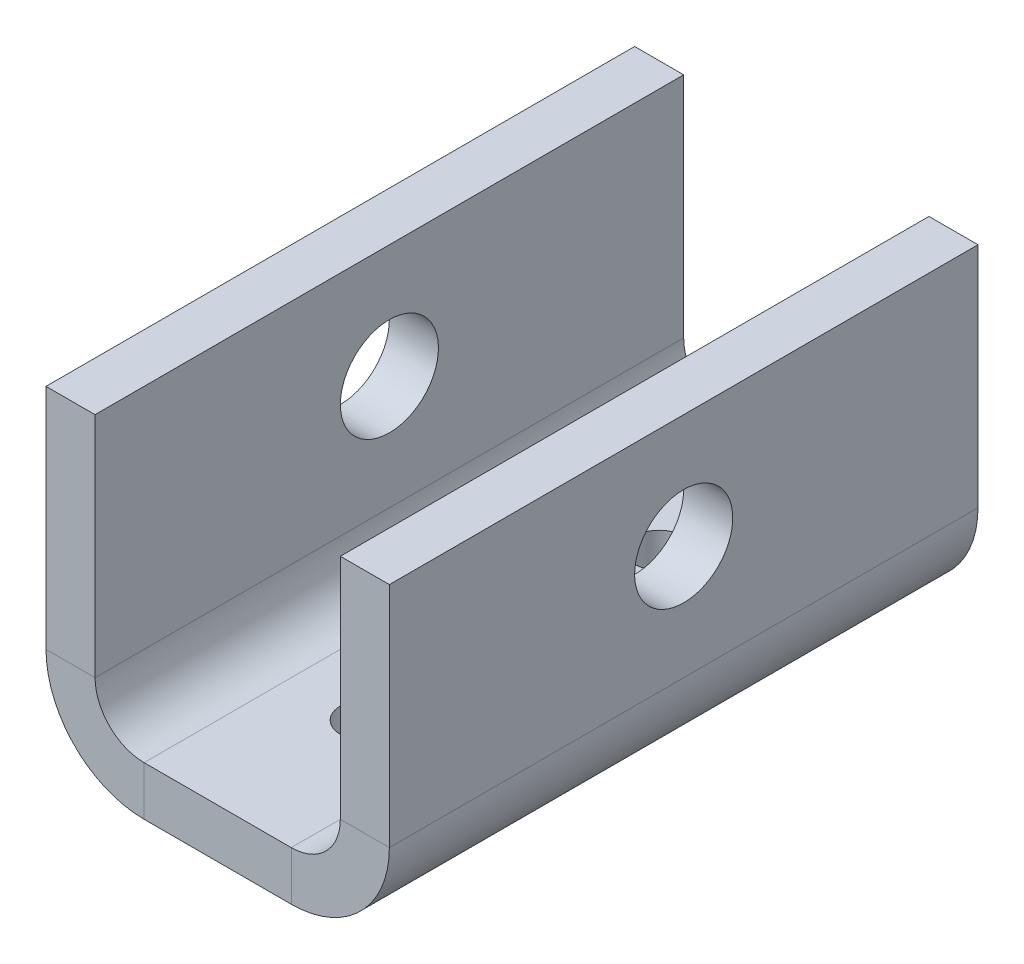
ISO-10303-21;
HEADER;
FILE_DESCRIPTION(('STEP AP214'),'2;1');
FILE_NAME('part.step','',(''),(''),'','','');
FILE_SCHEMA(('AUTOMOTIVE_DESIGN { 1 0 10303 214 1 1 1 1 }'));
ENDSEC;
DATA;
#1=APPLICATION_CONTEXT('core data for automotive mechanical design processes');
#2=APPLICATION_PROTOCOL_DEFINITION('international standard','automotive_design',2000,#1);
#3=PRODUCT_CONTEXT('',#1,'mechanical');
#4=PRODUCT('Part','Part','',(#3));
#5=PRODUCT_RELATED_PRODUCT_CATEGORY('part','',(#4));
#6=PRODUCT_DEFINITION_FORMATION('','',#4);
#7=PRODUCT_DEFINITION_CONTEXT('part definition',#1,'design');
#8=PRODUCT_DEFINITION('design','',#6,#7);
#9=PRODUCT_DEFINITION_SHAPE('','',#8);
#10=(LENGTH_UNIT() NAMED_UNIT(*) SI_UNIT(.MILLI.,.METRE.));
#11=(NAMED_UNIT(*) PLANE_ANGLE_UNIT() SI_UNIT($,.RADIAN.));
#12=(NAMED_UNIT(*) SI_UNIT($,.STERADIAN.) SOLID_ANGLE_UNIT());
#13=UNCERTAINTY_MEASURE_WITH_UNIT(LENGTH_MEASURE(1.E-05),#10,'distance_accuracy_value','');
#14=(GEOMETRIC_REPRESENTATION_CONTEXT(3) GLOBAL_UNCERTAINTY_ASSIGNED_CONTEXT((#13)) GLOBAL_UNIT_ASSIGNED_CONTEXT((#10,
#11,#12)) REPRESENTATION_CONTEXT('',''));
#15=CARTESIAN_POINT('',(0.,0.,0.));
#16=DIRECTION('',(0.,0.,1.));
#17=DIRECTION('',(1.,0.,0.));
#18=AXIS2_PLACEMENT_3D('',#15,#16,#17);
#19=CARTESIAN_POINT('',(0.,-5.,0.));
#20=DIRECTION('',(0.,-1.,0.));
#21=DIRECTION('',(0.,0.,-1.));
#22=AXIS2_PLACEMENT_3D('',#19,#20,#21);
#23=PLANE('',#22);
#24=CARTESIAN_POINT('',(0.,-5.,-15.));
#25=DIRECTION('',(0.,-1.,0.));
#26=DIRECTION('',(0.,0.,-1.));
#27=AXIS2_PLACEMENT_3D('',#24,#25,#26);
#28=CIRCLE('',#27,2.5);
#29=CARTESIAN_POINT('',(0.,-5.,-17.5));
#30=VERTEX_POINT('',#29);
#31=EDGE_CURVE('E266',#30,#30,#28,.T.);
#32=ORIENTED_EDGE('',*,*,#31,.F.);
#33=EDGE_LOOP('',(#32));
#34=FACE_BOUND('',#33,.T.);
#35=CARTESIAN_POINT('',(0.,-5.,15.));
#36=DIRECTION('',(0.,-1.,0.));
#37=DIRECTION('',(0.,0.,-1.));
#38=AXIS2_PLACEMENT_3D('',#35,#36,#37);
#39=CIRCLE('',#38,2.5);
#40=CARTESIAN_POINT('',(0.,-5.,12.5));
#41=VERTEX_POINT('',#40);
#42=EDGE_CURVE('E272',#41,#41,#39,.T.);
#43=ORIENTED_EDGE('',*,*,#42,.F.);
#44=EDGE_LOOP('',(#43));
#45=FACE_BOUND('',#44,.T.);
#46=DIRECTION('',(-1.,0.,0.));
#47=VECTOR('',#46,1.);
#48=CARTESIAN_POINT('',(-42.5,-5.,-30.));
#49=LINE('',#48,#47);
#50=CARTESIAN_POINT('',(7.50000000000001,-5.,-30.));
#51=VERTEX_POINT('',#50);
#52=CARTESIAN_POINT('',(-7.49999999999999,-5.,-30.));
#53=VERTEX_POINT('',#52);
#54=EDGE_CURVE('E254',#51,#53,#49,.T.);
#55=ORIENTED_EDGE('',*,*,#54,.F.);
#56=DIRECTION('',(0.,0.,1.));
#57=VECTOR('',#56,1.);
#58=CARTESIAN_POINT('',(7.50000000000001,-5.,0.));
#59=LINE('',#58,#57);
#60=CARTESIAN_POINT('',(7.5,-5.,30.));
#61=VERTEX_POINT('',#60);
#62=EDGE_CURVE('E245',#51,#61,#59,.T.);
#63=ORIENTED_EDGE('',*,*,#62,.T.);
#64=DIRECTION('',(1.,0.,0.));
#65=VECTOR('',#64,1.);
#66=CARTESIAN_POINT('',(-42.5,-5.,30.));
#67=LINE('',#66,#65);
#68=CARTESIAN_POINT('',(-7.49999999999999,-5.,30.));
#69=VERTEX_POINT('',#68);
#70=EDGE_CURVE('E237',#69,#61,#67,.T.);
#71=ORIENTED_EDGE('',*,*,#70,.F.);
#72=DIRECTION('',(0.,0.,1.));
#73=VECTOR('',#72,1.);
#74=CARTESIAN_POINT('',(-7.49999999999999,-5.,0.));
#75=LINE('',#74,#73);
#76=EDGE_CURVE('E233',#53,#69,#75,.T.);
#77=ORIENTED_EDGE('',*,*,#76,.F.);
#78=EDGE_LOOP('',(#55,#63,#71,#77));
#79=FACE_BOUND('',#78,.T.);
#80=ADVANCED_FACE('F53',(#34,#45,#79),#23,.T.);
#81=CARTESIAN_POINT('',(-42.5,-5.,-30.));
#82=DIRECTION('',(0.,0.,-1.));
#83=DIRECTION('',(-1.,0.,0.));
#84=AXIS2_PLACEMENT_3D('',#81,#82,#83);
#85=PLANE('',#84);
#86=DIRECTION('',(-1.,0.,0.));
#87=VECTOR('',#86,1.);
#88=CARTESIAN_POINT('',(-42.5,0.,-30.));
#89=LINE('',#88,#87);
#90=CARTESIAN_POINT('',(7.50000000000001,0.,-30.));
#91=VERTEX_POINT('',#90);
#92=CARTESIAN_POINT('',(-7.49999999999999,0.,-30.));
#93=VERTEX_POINT('',#92);
#94=EDGE_CURVE('E76',#91,#93,#89,.T.);
#95=ORIENTED_EDGE('',*,*,#94,.F.);
#96=DIRECTION('',(0.,-1.,0.));
#97=VECTOR('',#96,1.);
#98=CARTESIAN_POINT('',(7.50000000000001,-5.,-30.));
#99=LINE('',#98,#97);
#100=EDGE_CURVE('E248',#91,#51,#99,.T.);
#101=ORIENTED_EDGE('',*,*,#100,.T.);
#102=ORIENTED_EDGE('',*,*,#54,.T.);
#103=DIRECTION('',(0.,-1.,0.));
#104=VECTOR('',#103,1.);
#105=CARTESIAN_POINT('',(-7.49999999999999,-5.,-30.));
#106=LINE('',#105,#104);
#107=EDGE_CURVE('E242',#93,#53,#106,.T.);
#108=ORIENTED_EDGE('',*,*,#107,.F.);
#109=EDGE_LOOP('',(#95,#101,#102,#108));
#110=FACE_BOUND('',#109,.T.);
#111=ADVANCED_FACE('F306',(#110),#85,.T.);
#112=CARTESIAN_POINT('',(-42.5,-5.,30.));
#113=DIRECTION('',(0.,0.,1.));
#114=DIRECTION('',(1.,0.,0.));
#115=AXIS2_PLACEMENT_3D('',#112,#113,#114);
#116=PLANE('',#115);
#117=ORIENTED_EDGE('',*,*,#70,.T.);
#118=DIRECTION('',(0.,1.,0.));
#119=VECTOR('',#118,1.);
#120=CARTESIAN_POINT('',(7.50000000000001,-5.,30.));
#121=LINE('',#120,#119);
#122=CARTESIAN_POINT('',(7.50000000000001,0.,30.));
#123=VERTEX_POINT('',#122);
#124=EDGE_CURVE('E12',#61,#123,#121,.T.);
#125=ORIENTED_EDGE('',*,*,#124,.T.);
#126=DIRECTION('',(1.,0.,0.));
#127=VECTOR('',#126,1.);
#128=CARTESIAN_POINT('',(-42.5,0.,30.));
#129=LINE('',#128,#127);
#130=CARTESIAN_POINT('',(-7.49999999999999,0.,30.));
#131=VERTEX_POINT('',#130);
#132=EDGE_CURVE('E255',#131,#123,#129,.T.);
#133=ORIENTED_EDGE('',*,*,#132,.F.);
#134=DIRECTION('',(0.,1.,0.));
#135=VECTOR('',#134,1.);
#136=CARTESIAN_POINT('',(-7.49999999999999,-5.,30.));
#137=LINE('',#136,#135);
#138=EDGE_CURVE('E236',#69,#131,#137,.T.);
#139=ORIENTED_EDGE('',*,*,#138,.F.);
#140=EDGE_LOOP('',(#117,#125,#133,#139));
#141=FACE_BOUND('',#140,.T.);
#142=ADVANCED_FACE('F55',(#141),#116,.T.);
#143=CARTESIAN_POINT('',(0.,0.,0.));
#144=DIRECTION('',(0.,-1.,0.));
#145=DIRECTION('',(0.,0.,-1.));
#146=AXIS2_PLACEMENT_3D('',#143,#144,#145);
#147=PLANE('',#146);
#148=CARTESIAN_POINT('',(0.,0.,-15.));
#149=DIRECTION('',(0.,-1.,0.));
#150=DIRECTION('',(0.,0.,-1.));
#151=AXIS2_PLACEMENT_3D('',#148,#149,#150);
#152=CIRCLE('',#151,2.5);
#153=CARTESIAN_POINT('',(0.,0.,-17.5));
#154=VERTEX_POINT('',#153);
#155=EDGE_CURVE('E57',#154,#154,#152,.T.);
#156=ORIENTED_EDGE('',*,*,#155,.T.);
#157=EDGE_LOOP('',(#156));
#158=FACE_BOUND('',#157,.T.);
#159=CARTESIAN_POINT('',(0.,0.,15.));
#160=DIRECTION('',(0.,-1.,0.));
#161=DIRECTION('',(0.,0.,-1.));
#162=AXIS2_PLACEMENT_3D('',#159,#160,#161);
#163=CIRCLE('',#162,2.5);
#164=CARTESIAN_POINT('',(0.,0.,12.5));
#165=VERTEX_POINT('',#164);
#166=EDGE_CURVE('E264',#165,#165,#163,.T.);
#167=ORIENTED_EDGE('',*,*,#166,.T.);
#168=EDGE_LOOP('',(#167));
#169=FACE_BOUND('',#168,.T.);
#170=DIRECTION('',(0.,0.,1.));
#171=VECTOR('',#170,1.);
#172=CARTESIAN_POINT('',(7.50000000000001,0.,0.));
#173=LINE('',#172,#171);
#174=EDGE_CURVE('E62',#91,#123,#173,.T.);
#175=ORIENTED_EDGE('',*,*,#174,.F.);
#176=ORIENTED_EDGE('',*,*,#94,.T.);
#177=DIRECTION('',(0.,0.,1.));
#178=VECTOR('',#177,1.);
#179=CARTESIAN_POINT('',(-7.49999999999999,0.,0.));
#180=LINE('',#179,#178);
#181=EDGE_CURVE('E240',#93,#131,#180,.T.);
#182=ORIENTED_EDGE('',*,*,#181,.T.);
#183=ORIENTED_EDGE('',*,*,#132,.T.);
#184=EDGE_LOOP('',(#175,#176,#182,#183));
#185=FACE_BOUND('',#184,.T.);
#186=ADVANCED_FACE('F370',(#158,#169,#185),#147,.F.);
#187=CARTESIAN_POINT('',(-7.49999999999999,5.,-30.));
#188=DIRECTION('',(0.,0.,-1.));
#189=DIRECTION('',(-1.,0.,0.));
#190=AXIS2_PLACEMENT_3D('',#187,#188,#189);
#191=PLANE('',#190);
#192=DIRECTION('',(-1.,0.,0.));
#193=VECTOR('',#192,1.);
#194=CARTESIAN_POINT('',(-17.5,5.00000000000003,-30.));
#195=LINE('',#194,#193);
#196=CARTESIAN_POINT('',(-12.5,5.00000000000001,-30.));
#197=VERTEX_POINT('',#196);
#198=CARTESIAN_POINT('',(-17.5,5.00000000000003,-30.));
#199=VERTEX_POINT('',#198);
#200=EDGE_CURVE('E198',#197,#199,#195,.T.);
#201=ORIENTED_EDGE('',*,*,#200,.F.);
#202=CARTESIAN_POINT('',(-7.49999999999999,5.,-29.9999999999999));
#203=DIRECTION('',(0.,0.,-1.));
#204=DIRECTION('',(-1.,0.,0.));
#205=AXIS2_PLACEMENT_3D('',#202,#203,#204);
#206=CIRCLE('',#205,5.);
#207=EDGE_CURVE('E195',#197,#93,#206,.F.);
#208=ORIENTED_EDGE('',*,*,#207,.T.);
#209=ORIENTED_EDGE('',*,*,#107,.T.);
#210=CARTESIAN_POINT('',(-7.49999999999999,5.,-30.));
#211=DIRECTION('',(0.,0.,1.));
#212=DIRECTION('',(-1.,0.,0.));
#213=AXIS2_PLACEMENT_3D('',#210,#211,#212);
#214=CIRCLE('',#213,10.);
#215=EDGE_CURVE('E222',#199,#53,#214,.T.);
#216=ORIENTED_EDGE('',*,*,#215,.F.);
#217=EDGE_LOOP('',(#201,#208,#209,#216));
#218=FACE_BOUND('',#217,.T.);
#219=ADVANCED_FACE('F336',(#218),#191,.T.);
#220=CARTESIAN_POINT('',(-7.49999999999999,5.,30.));
#221=DIRECTION('',(0.,0.,1.));
#222=DIRECTION('',(1.,0.,0.));
#223=AXIS2_PLACEMENT_3D('',#220,#221,#222);
#224=PLANE('',#223);
#225=CARTESIAN_POINT('',(-7.49999999999999,5.,30.));
#226=DIRECTION('',(0.,0.,-1.));
#227=DIRECTION('',(-1.,0.,0.));
#228=AXIS2_PLACEMENT_3D('',#225,#226,#227);
#229=CIRCLE('',#228,5.);
#230=CARTESIAN_POINT('',(-12.5,5.00000000000002,30.));
#231=VERTEX_POINT('',#230);
#232=EDGE_CURVE('E226',#131,#231,#229,.T.);
#233=ORIENTED_EDGE('',*,*,#232,.T.);
#234=DIRECTION('',(1.,0.,0.));
#235=VECTOR('',#234,1.);
#236=CARTESIAN_POINT('',(-17.5,5.00000000000003,30.));
#237=LINE('',#236,#235);
#238=CARTESIAN_POINT('',(-17.5,5.00000000000003,30.));
#239=VERTEX_POINT('',#238);
#240=EDGE_CURVE('E207',#239,#231,#237,.T.);
#241=ORIENTED_EDGE('',*,*,#240,.F.);
#242=CARTESIAN_POINT('',(-7.49999999999999,5.,30.));
#243=DIRECTION('',(0.,0.,-1.));
#244=DIRECTION('',(1.,0.,0.));
#245=AXIS2_PLACEMENT_3D('',#242,#243,#244);
#246=CIRCLE('',#245,10.);
#247=EDGE_CURVE('E225',#69,#239,#246,.T.);
#248=ORIENTED_EDGE('',*,*,#247,.F.);
#249=ORIENTED_EDGE('',*,*,#138,.T.);
#250=EDGE_LOOP('',(#233,#241,#248,#249));
#251=FACE_BOUND('',#250,.T.);
#252=ADVANCED_FACE('F322',(#251),#224,.T.);
#253=CARTESIAN_POINT('',(-7.49999999999998,5.,61.3497458176505));
#254=DIRECTION('',(0.,0.,-1.));
#255=DIRECTION('',(-1.,0.,0.));
#256=AXIS2_PLACEMENT_3D('',#253,#254,#255);
#257=CYLINDRICAL_SURFACE('',#256,10.);
#258=ORIENTED_EDGE('',*,*,#76,.T.);
#259=ORIENTED_EDGE('',*,*,#247,.T.);
#260=DIRECTION('',(0.,0.,1.));
#261=VECTOR('',#260,1.);
#262=CARTESIAN_POINT('',(-17.5,5.00000000000003,0.));
#263=LINE('',#262,#261);
#264=EDGE_CURVE('E213',#199,#239,#263,.T.);
#265=ORIENTED_EDGE('',*,*,#264,.F.);
#266=ORIENTED_EDGE('',*,*,#215,.T.);
#267=EDGE_LOOP('',(#258,#259,#265,#266));
#268=FACE_BOUND('',#267,.T.);
#269=ADVANCED_FACE('F318',(#268),#257,.T.);
#270=CARTESIAN_POINT('',(-7.49999999999998,5.,61.3497458176505));
#271=DIRECTION('',(0.,0.,-1.));
#272=DIRECTION('',(-1.,0.,0.));
#273=AXIS2_PLACEMENT_3D('',#270,#271,#272);
#274=CYLINDRICAL_SURFACE('',#273,5.);
#275=ORIENTED_EDGE('',*,*,#181,.F.);
#276=ORIENTED_EDGE('',*,*,#207,.F.);
#277=DIRECTION('',(0.,0.,1.));
#278=VECTOR('',#277,1.);
#279=CARTESIAN_POINT('',(-12.5,5.00000000000002,0.));
#280=LINE('',#279,#278);
#281=EDGE_CURVE('E188',#197,#231,#280,.T.);
#282=ORIENTED_EDGE('',*,*,#281,.T.);
#283=ORIENTED_EDGE('',*,*,#232,.F.);
#284=EDGE_LOOP('',(#275,#276,#282,#283));
#285=FACE_BOUND('',#284,.T.);
#286=ADVANCED_FACE('F331',(#285),#274,.F.);
#287=CARTESIAN_POINT('',(-17.4999999999999,28.2190275490383,30.));
#288=DIRECTION('',(0.,1.,0.));
#289=DIRECTION('',(0.,0.,1.));
#290=AXIS2_PLACEMENT_3D('',#287,#288,#289);
#291=PLANE('',#290);
#292=DIRECTION('',(0.,0.,1.));
#293=VECTOR('',#292,1.);
#294=CARTESIAN_POINT('',(-12.4999999999999,28.2190275490383,30.));
#295=LINE('',#294,#293);
#296=CARTESIAN_POINT('',(-12.4999999999999,28.2190275490383,-30.));
#297=VERTEX_POINT('',#296);
#298=CARTESIAN_POINT('',(-12.4999999999999,28.2190275490383,30.));
#299=VERTEX_POINT('',#298);
#300=EDGE_CURVE('E202',#297,#299,#295,.T.);
#301=ORIENTED_EDGE('',*,*,#300,.F.);
#302=DIRECTION('',(1.,0.,0.));
#303=VECTOR('',#302,1.);
#304=CARTESIAN_POINT('',(-17.4999999999999,28.2190275490383,-30.));
#305=LINE('',#304,#303);
#306=CARTESIAN_POINT('',(-17.4999999999999,28.2190275490383,-30.));
#307=VERTEX_POINT('',#306);
#308=EDGE_CURVE('E192',#307,#297,#305,.T.);
#309=ORIENTED_EDGE('',*,*,#308,.F.);
#310=DIRECTION('',(0.,0.,1.));
#311=VECTOR('',#310,1.);
#312=CARTESIAN_POINT('',(-17.4999999999999,28.2190275490383,30.));
#313=LINE('',#312,#311);
#314=CARTESIAN_POINT('',(-17.4999999999999,28.2190275490383,30.));
#315=VERTEX_POINT('',#314);
#316=EDGE_CURVE('E217',#307,#315,#313,.T.);
#317=ORIENTED_EDGE('',*,*,#316,.T.);
#318=DIRECTION('',(1.,0.,0.));
#319=VECTOR('',#318,1.);
#320=CARTESIAN_POINT('',(-17.4999999999999,28.2190275490383,30.));
#321=LINE('',#320,#319);
#322=EDGE_CURVE('E215',#315,#299,#321,.T.);
#323=ORIENTED_EDGE('',*,*,#322,.T.);
#324=EDGE_LOOP('',(#301,#309,#317,#323));
#325=FACE_BOUND('',#324,.T.);
#326=ADVANCED_FACE('F346',(#325),#291,.T.);
#327=CARTESIAN_POINT('',(-17.5000000000001,-14.2809724509617,0.));
#328=DIRECTION('',(-1.,0.,0.));
#329=DIRECTION('',(0.,0.,-1.));
#330=AXIS2_PLACEMENT_3D('',#327,#328,#329);
#331=PLANE('',#330);
#332=CARTESIAN_POINT('',(-17.5,16.609513774519,0.));
#333=DIRECTION('',(-1.,0.,0.));
#334=DIRECTION('',(0.,-1.,0.));
#335=AXIS2_PLACEMENT_3D('',#332,#333,#334);
#336=CIRCLE('',#335,5.);
#337=CARTESIAN_POINT('',(-17.5,11.609513774519,0.));
#338=VERTEX_POINT('',#337);
#339=EDGE_CURVE('E263',#338,#338,#336,.F.);
#340=ORIENTED_EDGE('',*,*,#339,.T.);
#341=EDGE_LOOP('',(#340));
#342=FACE_BOUND('',#341,.T.);
#343=DIRECTION('',(0.,1.,0.));
#344=VECTOR('',#343,1.);
#345=CARTESIAN_POINT('',(-17.4999999999999,28.2190275490383,-30.));
#346=LINE('',#345,#344);
#347=EDGE_CURVE('E196',#199,#307,#346,.T.);
#348=ORIENTED_EDGE('',*,*,#347,.F.);
#349=ORIENTED_EDGE('',*,*,#264,.T.);
#350=DIRECTION('',(0.,-1.,0.));
#351=VECTOR('',#350,1.);
#352=CARTESIAN_POINT('',(-17.4999999999999,28.2190275490383,30.));
#353=LINE('',#352,#351);
#354=EDGE_CURVE('E210',#315,#239,#353,.T.);
#355=ORIENTED_EDGE('',*,*,#354,.F.);
#356=ORIENTED_EDGE('',*,*,#316,.F.);
#357=EDGE_LOOP('',(#348,#349,#355,#356));
#358=FACE_BOUND('',#357,.T.);
#359=ADVANCED_FACE('F343',(#342,#358),#331,.T.);
#360=CARTESIAN_POINT('',(-17.4999999999999,28.2190275490383,30.));
#361=DIRECTION('',(0.,0.,1.));
#362=DIRECTION('',(0.,-1.,0.));
#363=AXIS2_PLACEMENT_3D('',#360,#361,#362);
#364=PLANE('',#363);
#365=ORIENTED_EDGE('',*,*,#354,.T.);
#366=ORIENTED_EDGE('',*,*,#240,.T.);
#367=DIRECTION('',(0.,-1.,0.));
#368=VECTOR('',#367,1.);
#369=CARTESIAN_POINT('',(-12.4999999999999,28.2190275490383,30.));
#370=LINE('',#369,#368);
#371=EDGE_CURVE('E200',#299,#231,#370,.T.);
#372=ORIENTED_EDGE('',*,*,#371,.F.);
#373=ORIENTED_EDGE('',*,*,#322,.F.);
#374=EDGE_LOOP('',(#365,#366,#372,#373));
#375=FACE_BOUND('',#374,.T.);
#376=ADVANCED_FACE('F325',(#375),#364,.T.);
#377=CARTESIAN_POINT('',(-12.5000000000001,-14.2809724509617,0.));
#378=DIRECTION('',(-1.,0.,0.));
#379=DIRECTION('',(0.,0.,-1.));
#380=AXIS2_PLACEMENT_3D('',#377,#378,#379);
#381=PLANE('',#380);
#382=CARTESIAN_POINT('',(-12.4999999999999,16.6095137745191,0.));
#383=DIRECTION('',(-1.,0.,0.));
#384=DIRECTION('',(0.,-1.,0.));
#385=AXIS2_PLACEMENT_3D('',#382,#383,#384);
#386=CIRCLE('',#385,5.);
#387=CARTESIAN_POINT('',(-12.5,11.6095137745191,0.));
#388=VERTEX_POINT('',#387);
#389=EDGE_CURVE('E180',#388,#388,#386,.T.);
#390=ORIENTED_EDGE('',*,*,#389,.T.);
#391=EDGE_LOOP('',(#390));
#392=FACE_BOUND('',#391,.T.);
#393=ORIENTED_EDGE('',*,*,#281,.F.);
#394=DIRECTION('',(0.,1.,0.));
#395=VECTOR('',#394,1.);
#396=CARTESIAN_POINT('',(-12.4999999999999,28.2190275490383,-30.));
#397=LINE('',#396,#395);
#398=EDGE_CURVE('E205',#197,#297,#397,.T.);
#399=ORIENTED_EDGE('',*,*,#398,.T.);
#400=ORIENTED_EDGE('',*,*,#300,.T.);
#401=ORIENTED_EDGE('',*,*,#371,.T.);
#402=EDGE_LOOP('',(#393,#399,#400,#401));
#403=FACE_BOUND('',#402,.T.);
#404=ADVANCED_FACE('F334',(#392,#403),#381,.F.);
#405=CARTESIAN_POINT('',(-17.4999999999999,28.2190275490383,-30.));
#406=DIRECTION('',(0.,0.,-1.));
#407=DIRECTION('',(0.,1.,0.));
#408=AXIS2_PLACEMENT_3D('',#405,#406,#407);
#409=PLANE('',#408);
#410=ORIENTED_EDGE('',*,*,#398,.F.);
#411=ORIENTED_EDGE('',*,*,#200,.T.);
#412=ORIENTED_EDGE('',*,*,#347,.T.);
#413=ORIENTED_EDGE('',*,*,#308,.T.);
#414=EDGE_LOOP('',(#410,#411,#412,#413));
#415=FACE_BOUND('',#414,.T.);
#416=ADVANCED_FACE('F339',(#415),#409,.T.);
#417=CARTESIAN_POINT('',(7.50000000000001,5.,-30.));
#418=DIRECTION('',(0.,0.,-1.));
#419=DIRECTION('',(-1.,0.,0.));
#420=AXIS2_PLACEMENT_3D('',#417,#418,#419);
#421=PLANE('',#420);
#422=ORIENTED_EDGE('',*,*,#100,.F.);
#423=CARTESIAN_POINT('',(7.50000000000001,5.,-30.));
#424=DIRECTION('',(0.,0.,1.));
#425=DIRECTION('',(1.,0.,0.));
#426=AXIS2_PLACEMENT_3D('',#423,#424,#425);
#427=CIRCLE('',#426,5.);
#428=CARTESIAN_POINT('',(12.5,5.00000000000002,-30.));
#429=VERTEX_POINT('',#428);
#430=EDGE_CURVE('E163',#91,#429,#427,.T.);
#431=ORIENTED_EDGE('',*,*,#430,.T.);
#432=DIRECTION('',(1.,0.,0.));
#433=VECTOR('',#432,1.);
#434=CARTESIAN_POINT('',(17.5,5.00000000000004,-30.));
#435=LINE('',#434,#433);
#436=CARTESIAN_POINT('',(17.5,5.00000000000004,-30.));
#437=VERTEX_POINT('',#436);
#438=EDGE_CURVE('E170',#429,#437,#435,.T.);
#439=ORIENTED_EDGE('',*,*,#438,.T.);
#440=CARTESIAN_POINT('',(7.50000000000001,5.,-30.));
#441=DIRECTION('',(0.,0.,1.));
#442=DIRECTION('',(-1.,0.,0.));
#443=AXIS2_PLACEMENT_3D('',#440,#441,#442);
#444=CIRCLE('',#443,10.);
#445=EDGE_CURVE('E181',#51,#437,#444,.T.);
#446=ORIENTED_EDGE('',*,*,#445,.F.);
#447=EDGE_LOOP('',(#422,#431,#439,#446));
#448=FACE_BOUND('',#447,.T.);
#449=ADVANCED_FACE('F298',(#448),#421,.T.);
#450=CARTESIAN_POINT('',(7.50000000000001,5.,30.));
#451=DIRECTION('',(0.,0.,1.));
#452=DIRECTION('',(1.,0.,0.));
#453=AXIS2_PLACEMENT_3D('',#450,#451,#452);
#454=PLANE('',#453);
#455=DIRECTION('',(-1.,0.,0.));
#456=VECTOR('',#455,1.);
#457=CARTESIAN_POINT('',(17.5,5.00000000000004,30.));
#458=LINE('',#457,#456);
#459=CARTESIAN_POINT('',(17.5,5.00000000000004,30.));
#460=VERTEX_POINT('',#459);
#461=CARTESIAN_POINT('',(12.5,5.00000000000002,30.));
#462=VERTEX_POINT('',#461);
#463=EDGE_CURVE('E152',#460,#462,#458,.T.);
#464=ORIENTED_EDGE('',*,*,#463,.T.);
#465=CARTESIAN_POINT('',(7.50000000000001,5.,29.9999999999999));
#466=DIRECTION('',(0.,0.,1.));
#467=DIRECTION('',(1.,0.,0.));
#468=AXIS2_PLACEMENT_3D('',#465,#466,#467);
#469=CIRCLE('',#468,5.);
#470=EDGE_CURVE('E185',#462,#123,#469,.F.);
#471=ORIENTED_EDGE('',*,*,#470,.T.);
#472=ORIENTED_EDGE('',*,*,#124,.F.);
#473=CARTESIAN_POINT('',(7.50000000000001,5.,30.));
#474=DIRECTION('',(0.,0.,-1.));
#475=DIRECTION('',(1.,0.,0.));
#476=AXIS2_PLACEMENT_3D('',#473,#474,#475);
#477=CIRCLE('',#476,10.);
#478=EDGE_CURVE('E184',#460,#61,#477,.T.);
#479=ORIENTED_EDGE('',*,*,#478,.F.);
#480=EDGE_LOOP('',(#464,#471,#472,#479));
#481=FACE_BOUND('',#480,.T.);
#482=ADVANCED_FACE('F311',(#481),#454,.T.);
#483=CARTESIAN_POINT('',(7.5,5.,-61.3497458176505));
#484=DIRECTION('',(0.,0.,1.));
#485=DIRECTION('',(1.,0.,0.));
#486=AXIS2_PLACEMENT_3D('',#483,#484,#485);
#487=CYLINDRICAL_SURFACE('',#486,10.);
#488=ORIENTED_EDGE('',*,*,#478,.T.);
#489=ORIENTED_EDGE('',*,*,#62,.F.);
#490=ORIENTED_EDGE('',*,*,#445,.T.);
#491=DIRECTION('',(0.,0.,1.));
#492=VECTOR('',#491,1.);
#493=CARTESIAN_POINT('',(17.5,5.00000000000004,0.));
#494=LINE('',#493,#492);
#495=EDGE_CURVE('E178',#437,#460,#494,.T.);
#496=ORIENTED_EDGE('',*,*,#495,.T.);
#497=EDGE_LOOP('',(#488,#489,#490,#496));
#498=FACE_BOUND('',#497,.T.);
#499=ADVANCED_FACE('F301',(#498),#487,.T.);
#500=CARTESIAN_POINT('',(7.5,5.,-61.3497458176505));
#501=DIRECTION('',(0.,0.,1.));
#502=DIRECTION('',(1.,0.,0.));
#503=AXIS2_PLACEMENT_3D('',#500,#501,#502);
#504=CYLINDRICAL_SURFACE('',#503,5.);
#505=ORIENTED_EDGE('',*,*,#470,.F.);
#506=DIRECTION('',(0.,0.,1.));
#507=VECTOR('',#506,1.);
#508=CARTESIAN_POINT('',(12.5,5.00000000000002,0.));
#509=LINE('',#508,#507);
#510=EDGE_CURVE('E288',#429,#462,#509,.T.);
#511=ORIENTED_EDGE('',*,*,#510,.F.);
#512=ORIENTED_EDGE('',*,*,#430,.F.);
#513=ORIENTED_EDGE('',*,*,#174,.T.);
#514=EDGE_LOOP('',(#505,#511,#512,#513));
#515=FACE_BOUND('',#514,.T.);
#516=ADVANCED_FACE('F307',(#515),#504,.F.);
#517=CARTESIAN_POINT('',(17.4999999999999,28.2190275490383,30.));
#518=DIRECTION('',(0.,1.,0.));
#519=DIRECTION('',(0.,0.,-1.));
#520=AXIS2_PLACEMENT_3D('',#517,#518,#519);
#521=PLANE('',#520);
#522=DIRECTION('',(0.,0.,-1.));
#523=VECTOR('',#522,1.);
#524=CARTESIAN_POINT('',(12.4999999999999,28.2190275490383,30.));
#525=LINE('',#524,#523);
#526=CARTESIAN_POINT('',(12.4999999999999,28.2190275490383,30.));
#527=VERTEX_POINT('',#526);
#528=CARTESIAN_POINT('',(12.4999999999999,28.2190275490383,-30.));
#529=VERTEX_POINT('',#528);
#530=EDGE_CURVE('E156',#527,#529,#525,.T.);
#531=ORIENTED_EDGE('',*,*,#530,.F.);
#532=DIRECTION('',(-1.,0.,0.));
#533=VECTOR('',#532,1.);
#534=CARTESIAN_POINT('',(17.4999999999999,28.2190275490383,30.));
#535=LINE('',#534,#533);
#536=CARTESIAN_POINT('',(17.4999999999999,28.2190275490383,30.));
#537=VERTEX_POINT('',#536);
#538=EDGE_CURVE('E149',#537,#527,#535,.T.);
#539=ORIENTED_EDGE('',*,*,#538,.F.);
#540=DIRECTION('',(0.,0.,-1.));
#541=VECTOR('',#540,1.);
#542=CARTESIAN_POINT('',(17.4999999999999,28.2190275490383,30.));
#543=LINE('',#542,#541);
#544=CARTESIAN_POINT('',(17.4999999999999,28.2190275490383,-30.));
#545=VERTEX_POINT('',#544);
#546=EDGE_CURVE('E161',#537,#545,#543,.T.);
#547=ORIENTED_EDGE('',*,*,#546,.T.);
#548=DIRECTION('',(-1.,0.,0.));
#549=VECTOR('',#548,1.);
#550=CARTESIAN_POINT('',(17.4999999999999,28.2190275490383,-30.));
#551=LINE('',#550,#549);
#552=EDGE_CURVE('E169',#545,#529,#551,.T.);
#553=ORIENTED_EDGE('',*,*,#552,.T.);
#554=EDGE_LOOP('',(#531,#539,#547,#553));
#555=FACE_BOUND('',#554,.T.);
#556=ADVANCED_FACE('F160',(#555),#521,.T.);
#557=CARTESIAN_POINT('',(17.5000000000001,-14.2809724509617,0.));
#558=DIRECTION('',(1.,0.,0.));
#559=DIRECTION('',(0.,0.,-1.));
#560=AXIS2_PLACEMENT_3D('',#557,#558,#559);
#561=PLANE('',#560);
#562=CARTESIAN_POINT('',(17.5,16.6095137745192,0.));
#563=DIRECTION('',(1.,0.,0.));
#564=DIRECTION('',(0.,1.,0.));
#565=AXIS2_PLACEMENT_3D('',#562,#563,#564);
#566=CIRCLE('',#565,5.);
#567=CARTESIAN_POINT('',(17.5,21.6095137745192,0.));
#568=VERTEX_POINT('',#567);
#569=EDGE_CURVE('E270',#568,#568,#566,.T.);
#570=ORIENTED_EDGE('',*,*,#569,.F.);
#571=EDGE_LOOP('',(#570));
#572=FACE_BOUND('',#571,.T.);
#573=ORIENTED_EDGE('',*,*,#495,.F.);
#574=DIRECTION('',(0.,-1.,0.));
#575=VECTOR('',#574,1.);
#576=CARTESIAN_POINT('',(17.5000000000002,-56.7809724509617,-30.));
#577=LINE('',#576,#575);
#578=EDGE_CURVE('E168',#545,#437,#577,.T.);
#579=ORIENTED_EDGE('',*,*,#578,.F.);
#580=ORIENTED_EDGE('',*,*,#546,.F.);
#581=DIRECTION('',(0.,1.,0.));
#582=VECTOR('',#581,1.);
#583=CARTESIAN_POINT('',(17.5000000000002,-56.7809724509617,30.));
#584=LINE('',#583,#582);
#585=EDGE_CURVE('E146',#460,#537,#584,.T.);
#586=ORIENTED_EDGE('',*,*,#585,.F.);
#587=EDGE_LOOP('',(#573,#579,#580,#586));
#588=FACE_BOUND('',#587,.T.);
#589=ADVANCED_FACE('F166',(#572,#588),#561,.T.);
#590=CARTESIAN_POINT('',(17.5000000000002,-56.7809724509617,-30.));
#591=DIRECTION('',(0.,0.,-1.));
#592=DIRECTION('',(0.,-1.,0.));
#593=AXIS2_PLACEMENT_3D('',#590,#591,#592);
#594=PLANE('',#593);
#595=ORIENTED_EDGE('',*,*,#438,.F.);
#596=DIRECTION('',(0.,-1.,0.));
#597=VECTOR('',#596,1.);
#598=CARTESIAN_POINT('',(12.5000000000002,-56.7809724509617,-30.));
#599=LINE('',#598,#597);
#600=EDGE_CURVE('E291',#529,#429,#599,.T.);
#601=ORIENTED_EDGE('',*,*,#600,.F.);
#602=ORIENTED_EDGE('',*,*,#552,.F.);
#603=ORIENTED_EDGE('',*,*,#578,.T.);
#604=EDGE_LOOP('',(#595,#601,#602,#603));
#605=FACE_BOUND('',#604,.T.);
#606=ADVANCED_FACE('F294',(#605),#594,.T.);
#607=CARTESIAN_POINT('',(12.5000000000001,-14.2809724509617,0.));
#608=DIRECTION('',(1.,0.,0.));
#609=DIRECTION('',(0.,0.,-1.));
#610=AXIS2_PLACEMENT_3D('',#607,#608,#609);
#611=PLANE('',#610);
#612=CARTESIAN_POINT('',(12.5,16.6095137745191,0.));
#613=DIRECTION('',(1.,0.,0.));
#614=DIRECTION('',(0.,1.,0.));
#615=AXIS2_PLACEMENT_3D('',#612,#613,#614);
#616=CIRCLE('',#615,5.);
#617=CARTESIAN_POINT('',(12.4999999999999,21.6095137745192,0.));
#618=VERTEX_POINT('',#617);
#619=EDGE_CURVE('E261',#618,#618,#616,.T.);
#620=ORIENTED_EDGE('',*,*,#619,.T.);
#621=EDGE_LOOP('',(#620));
#622=FACE_BOUND('',#621,.T.);
#623=ORIENTED_EDGE('',*,*,#600,.T.);
#624=ORIENTED_EDGE('',*,*,#510,.T.);
#625=DIRECTION('',(0.,1.,0.));
#626=VECTOR('',#625,1.);
#627=CARTESIAN_POINT('',(12.5000000000002,-56.7809724509617,30.));
#628=LINE('',#627,#626);
#629=EDGE_CURVE('E286',#462,#527,#628,.T.);
#630=ORIENTED_EDGE('',*,*,#629,.T.);
#631=ORIENTED_EDGE('',*,*,#530,.T.);
#632=EDGE_LOOP('',(#623,#624,#630,#631));
#633=FACE_BOUND('',#632,.T.);
#634=ADVANCED_FACE('F309',(#622,#633),#611,.F.);
#635=CARTESIAN_POINT('',(17.5000000000002,-56.7809724509617,30.));
#636=DIRECTION('',(0.,0.,1.));
#637=DIRECTION('',(0.,1.,0.));
#638=AXIS2_PLACEMENT_3D('',#635,#636,#637);
#639=PLANE('',#638);
#640=ORIENTED_EDGE('',*,*,#463,.F.);
#641=ORIENTED_EDGE('',*,*,#585,.T.);
#642=ORIENTED_EDGE('',*,*,#538,.T.);
#643=ORIENTED_EDGE('',*,*,#629,.F.);
#644=EDGE_LOOP('',(#640,#641,#642,#643));
#645=FACE_BOUND('',#644,.T.);
#646=ADVANCED_FACE('F148',(#645),#639,.T.);
#647=CARTESIAN_POINT('',(-31.6421356237309,16.609513774519,0.));
#648=DIRECTION('',(1.,0.,0.));
#649=DIRECTION('',(0.,1.,0.));
#650=AXIS2_PLACEMENT_3D('',#647,#648,#649);
#651=CYLINDRICAL_SURFACE('',#650,5.);
#652=ORIENTED_EDGE('',*,*,#569,.T.);
#653=EDGE_LOOP('',(#652));
#654=FACE_BOUND('',#653,.T.);
#655=ORIENTED_EDGE('',*,*,#619,.F.);
#656=EDGE_LOOP('',(#655));
#657=FACE_BOUND('',#656,.T.);
#658=ADVANCED_FACE('F390',(#654,#657),#651,.F.);
#659=ORIENTED_EDGE('',*,*,#339,.F.);
#660=EDGE_LOOP('',(#659));
#661=FACE_BOUND('',#660,.T.);
#662=ORIENTED_EDGE('',*,*,#389,.F.);
#663=EDGE_LOOP('',(#662));
#664=FACE_BOUND('',#663,.T.);
#665=ADVANCED_FACE('F385',(#661,#664),#651,.F.);
#666=CARTESIAN_POINT('',(0.,28.2190275490383,15.));
#667=DIRECTION('',(0.,-1.,0.));
#668=DIRECTION('',(0.,0.,-1.));
#669=AXIS2_PLACEMENT_3D('',#666,#667,#668);
#670=CYLINDRICAL_SURFACE('',#669,2.5);
#671=ORIENTED_EDGE('',*,*,#42,.T.);
#672=EDGE_LOOP('',(#671));
#673=FACE_BOUND('',#672,.T.);
#674=ORIENTED_EDGE('',*,*,#166,.F.);
#675=EDGE_LOOP('',(#674));
#676=FACE_BOUND('',#675,.T.);
#677=ADVANCED_FACE('F381',(#673,#676),#670,.F.);
#678=CARTESIAN_POINT('',(0.,28.2190275490383,-15.));
#679=DIRECTION('',(0.,-1.,0.));
#680=DIRECTION('',(0.,0.,-1.));
#681=AXIS2_PLACEMENT_3D('',#678,#679,#680);
#682=CYLINDRICAL_SURFACE('',#681,2.5);
#683=ORIENTED_EDGE('',*,*,#31,.T.);
#684=EDGE_LOOP('',(#683));
#685=FACE_BOUND('',#684,.T.);
#686=ORIENTED_EDGE('',*,*,#155,.F.);
#687=EDGE_LOOP('',(#686));
#688=FACE_BOUND('',#687,.T.);
#689=ADVANCED_FACE('F379',(#685,#688),#682,.F.);
#690=CLOSED_SHELL('',(#80,#111,#142,#186,#219,#252,#269,#286,#326,#359,#376,#404,#416,#449,#482,
#499,#516,#556,#589,#606,#634,#646,#658,#665,#677,#689));
#691=MANIFOLD_SOLID_BREP('B2',#690);
#692=ADVANCED_BREP_SHAPE_REPRESENTATION('',(#18,#691),#14);
#693=SHAPE_DEFINITION_REPRESENTATION(#9,#692);
ENDSEC;
END-ISO-10303-21;
